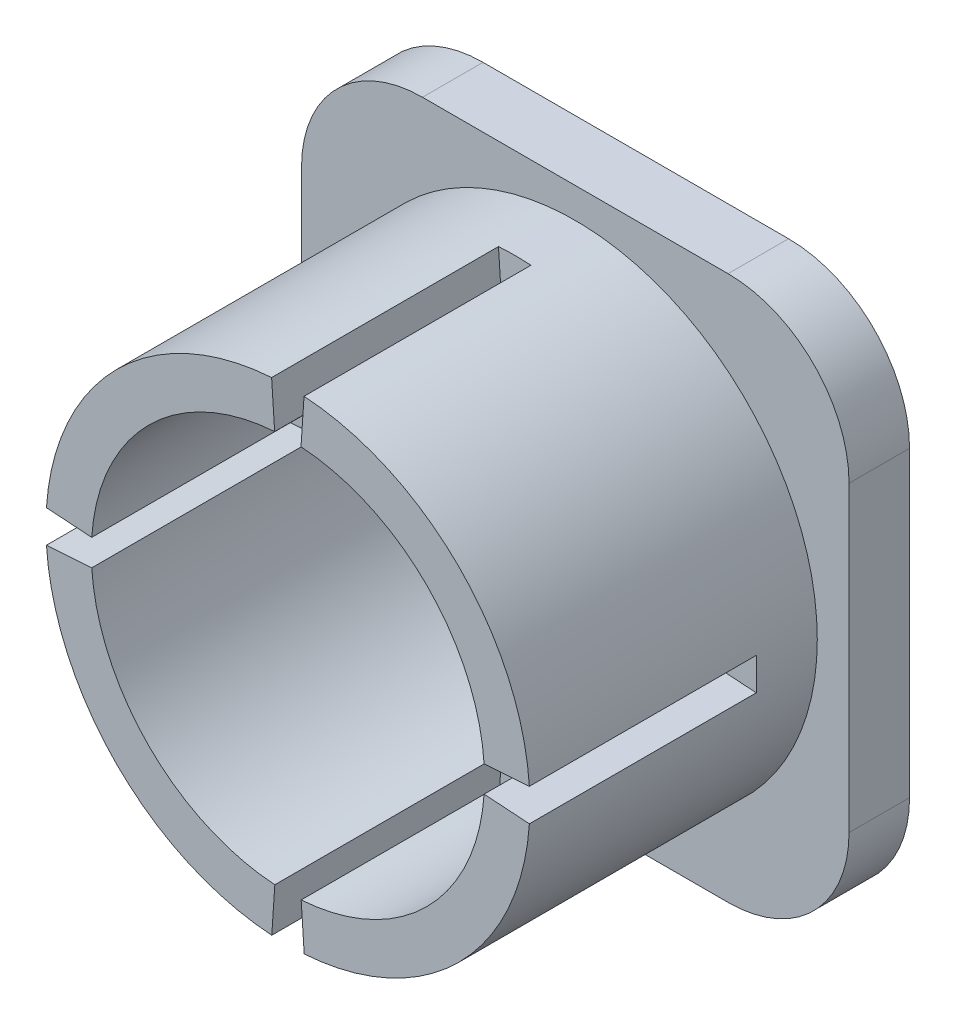
ISO-10303-21;
HEADER;
FILE_DESCRIPTION(('STEP AP214'),'2;1');
FILE_NAME('part.step','',(''),(''),'','','');
FILE_SCHEMA(('AUTOMOTIVE_DESIGN { 1 0 10303 214 1 1 1 1 }'));
ENDSEC;
DATA;
#1=APPLICATION_CONTEXT('core data for automotive mechanical design processes');
#2=APPLICATION_PROTOCOL_DEFINITION('international standard','automotive_design',2000,#1);
#3=PRODUCT_CONTEXT('',#1,'mechanical');
#4=PRODUCT('Part','Part','',(#3));
#5=PRODUCT_RELATED_PRODUCT_CATEGORY('part','',(#4));
#6=PRODUCT_DEFINITION_FORMATION('','',#4);
#7=PRODUCT_DEFINITION_CONTEXT('part definition',#1,'design');
#8=PRODUCT_DEFINITION('design','',#6,#7);
#9=PRODUCT_DEFINITION_SHAPE('','',#8);
#10=(LENGTH_UNIT() NAMED_UNIT(*) SI_UNIT(.MILLI.,.METRE.));
#11=(NAMED_UNIT(*) PLANE_ANGLE_UNIT() SI_UNIT($,.RADIAN.));
#12=(NAMED_UNIT(*) SI_UNIT($,.STERADIAN.) SOLID_ANGLE_UNIT());
#13=UNCERTAINTY_MEASURE_WITH_UNIT(LENGTH_MEASURE(1.E-05),#10,'distance_accuracy_value','');
#14=(GEOMETRIC_REPRESENTATION_CONTEXT(3) GLOBAL_UNCERTAINTY_ASSIGNED_CONTEXT((#13)) GLOBAL_UNIT_ASSIGNED_CONTEXT((#10,
#11,#12)) REPRESENTATION_CONTEXT('',''));
#15=CARTESIAN_POINT('',(0.,0.,0.));
#16=DIRECTION('',(0.,0.,1.));
#17=DIRECTION('',(1.,0.,0.));
#18=AXIS2_PLACEMENT_3D('',#15,#16,#17);
#19=CARTESIAN_POINT('',(0.,0.,11.5001));
#20=DIRECTION('',(0.,0.,-1.));
#21=DIRECTION('',(-1.,0.,0.));
#22=AXIS2_PLACEMENT_3D('',#19,#20,#21);
#23=CYLINDRICAL_SURFACE('',#22,8.);
#24=CARTESIAN_POINT('',(0.,0.,2.0001));
#25=DIRECTION('',(0.,0.,1.));
#26=DIRECTION('',(1.,0.,0.));
#27=AXIS2_PLACEMENT_3D('',#24,#25,#26);
#28=CIRCLE('',#27,8.);
#29=CARTESIAN_POINT('',(8.,0.,2.0001));
#30=VERTEX_POINT('',#29);
#31=EDGE_CURVE('E478',#30,#30,#28,.T.);
#32=ORIENTED_EDGE('',*,*,#31,.T.);
#33=EDGE_LOOP('',(#32));
#34=FACE_BOUND('',#33,.T.);
#35=DIRECTION('',(0.,0.,-1.));
#36=VECTOR('',#35,1.);
#37=CARTESIAN_POINT('',(-0.533399136129928,-7.98219802821101,11.5001));
#38=LINE('',#37,#36);
#39=CARTESIAN_POINT('',(-0.533399136129928,-7.98219802821102,11.5001));
#40=VERTEX_POINT('',#39);
#41=CARTESIAN_POINT('',(-0.533399136129928,-7.98219802821101,4.0001));
#42=VERTEX_POINT('',#41);
#43=EDGE_CURVE('E258',#40,#42,#38,.T.);
#44=ORIENTED_EDGE('',*,*,#43,.F.);
#45=CARTESIAN_POINT('',(0.,0.,11.5001));
#46=DIRECTION('',(0.,0.,1.));
#47=DIRECTION('',(1.,0.,0.));
#48=AXIS2_PLACEMENT_3D('',#45,#46,#47);
#49=CIRCLE('',#48,8.);
#50=CARTESIAN_POINT('',(-7.98181940167581,-0.539035285516247,11.5001));
#51=VERTEX_POINT('',#50);
#52=EDGE_CURVE('E230',#51,#40,#49,.T.);
#53=ORIENTED_EDGE('',*,*,#52,.F.);
#54=DIRECTION('',(0.,0.,-1.));
#55=VECTOR('',#54,1.);
#56=CARTESIAN_POINT('',(-7.98181940167581,-0.539035285516247,11.5001));
#57=LINE('',#56,#55);
#58=CARTESIAN_POINT('',(-7.98181940167581,-0.539035285516247,4.0001));
#59=VERTEX_POINT('',#58);
#60=EDGE_CURVE('E256',#51,#59,#57,.T.);
#61=ORIENTED_EDGE('',*,*,#60,.T.);
#62=CARTESIAN_POINT('',(0.,0.,4.0001));
#63=DIRECTION('',(0.,0.,-1.));
#64=DIRECTION('',(-1.,0.,0.));
#65=AXIS2_PLACEMENT_3D('',#62,#63,#64);
#66=CIRCLE('',#65,8.);
#67=CARTESIAN_POINT('',(-7.98219802821101,0.533399136130011,4.0001));
#68=VERTEX_POINT('',#67);
#69=EDGE_CURVE('E334',#59,#68,#66,.T.);
#70=ORIENTED_EDGE('',*,*,#69,.T.);
#71=DIRECTION('',(0.,0.,-1.));
#72=VECTOR('',#71,1.);
#73=CARTESIAN_POINT('',(-7.98219802821101,0.533399136130011,11.5001));
#74=LINE('',#73,#72);
#75=CARTESIAN_POINT('',(-7.98219802821101,0.533399136130012,11.5001));
#76=VERTEX_POINT('',#75);
#77=EDGE_CURVE('E337',#76,#68,#74,.T.);
#78=ORIENTED_EDGE('',*,*,#77,.F.);
#79=CARTESIAN_POINT('',(-0.539035285516331,7.98181940167581,11.5001));
#80=VERTEX_POINT('',#79);
#81=EDGE_CURVE('E228',#80,#76,#49,.T.);
#82=ORIENTED_EDGE('',*,*,#81,.F.);
#83=DIRECTION('',(0.,0.,-1.));
#84=VECTOR('',#83,1.);
#85=CARTESIAN_POINT('',(-0.539035285516331,7.98181940167581,11.5001));
#86=LINE('',#85,#84);
#87=CARTESIAN_POINT('',(-0.539035285516331,7.98181940167581,4.0001));
#88=VERTEX_POINT('',#87);
#89=EDGE_CURVE('E280',#80,#88,#86,.T.);
#90=ORIENTED_EDGE('',*,*,#89,.T.);
#91=CARTESIAN_POINT('',(0.,0.,4.0001));
#92=DIRECTION('',(0.,0.,-1.));
#93=DIRECTION('',(-1.,0.,0.));
#94=AXIS2_PLACEMENT_3D('',#91,#92,#93);
#95=CIRCLE('',#94,8.);
#96=CARTESIAN_POINT('',(0.533399136129928,7.98219802821101,4.0001));
#97=VERTEX_POINT('',#96);
#98=EDGE_CURVE('E276',#88,#97,#95,.T.);
#99=ORIENTED_EDGE('',*,*,#98,.T.);
#100=DIRECTION('',(0.,0.,-1.));
#101=VECTOR('',#100,1.);
#102=CARTESIAN_POINT('',(0.533399136129928,7.98219802821101,11.5001));
#103=LINE('',#102,#101);
#104=CARTESIAN_POINT('',(0.533399136129928,7.98219802821102,11.5001));
#105=VERTEX_POINT('',#104);
#106=EDGE_CURVE('E224',#105,#97,#103,.T.);
#107=ORIENTED_EDGE('',*,*,#106,.F.);
#108=CARTESIAN_POINT('',(7.98181940167581,0.539035285516303,11.5001));
#109=VERTEX_POINT('',#108);
#110=EDGE_CURVE('E215',#109,#105,#49,.T.);
#111=ORIENTED_EDGE('',*,*,#110,.F.);
#112=DIRECTION('',(0.,0.,-1.));
#113=VECTOR('',#112,1.);
#114=CARTESIAN_POINT('',(7.98181940167581,0.539035285516303,11.5001));
#115=LINE('',#114,#113);
#116=CARTESIAN_POINT('',(7.98181940167581,0.539035285516303,4.0001));
#117=VERTEX_POINT('',#116);
#118=EDGE_CURVE('E198',#109,#117,#115,.T.);
#119=ORIENTED_EDGE('',*,*,#118,.T.);
#120=CARTESIAN_POINT('',(0.,0.,4.0001));
#121=DIRECTION('',(0.,0.,-1.));
#122=DIRECTION('',(-1.,0.,0.));
#123=AXIS2_PLACEMENT_3D('',#120,#121,#122);
#124=CIRCLE('',#123,8.);
#125=CARTESIAN_POINT('',(7.98219802821101,-0.533399136129956,4.0001));
#126=VERTEX_POINT('',#125);
#127=EDGE_CURVE('E209',#117,#126,#124,.T.);
#128=ORIENTED_EDGE('',*,*,#127,.T.);
#129=DIRECTION('',(0.,0.,-1.));
#130=VECTOR('',#129,1.);
#131=CARTESIAN_POINT('',(7.98219802821101,-0.533399136129956,11.5001));
#132=LINE('',#131,#130);
#133=CARTESIAN_POINT('',(7.98219802821101,-0.533399136129956,11.5001));
#134=VERTEX_POINT('',#133);
#135=EDGE_CURVE('E208',#134,#126,#132,.T.);
#136=ORIENTED_EDGE('',*,*,#135,.F.);
#137=CARTESIAN_POINT('',(0.539035285516331,-7.98181940167581,11.5001));
#138=VERTEX_POINT('',#137);
#139=EDGE_CURVE('E225',#138,#134,#49,.T.);
#140=ORIENTED_EDGE('',*,*,#139,.F.);
#141=DIRECTION('',(0.,0.,-1.));
#142=VECTOR('',#141,1.);
#143=CARTESIAN_POINT('',(0.539035285516331,-7.98181940167581,11.5001));
#144=LINE('',#143,#142);
#145=CARTESIAN_POINT('',(0.539035285516331,-7.98181940167581,4.0001));
#146=VERTEX_POINT('',#145);
#147=EDGE_CURVE('E265',#138,#146,#144,.T.);
#148=ORIENTED_EDGE('',*,*,#147,.T.);
#149=CARTESIAN_POINT('',(0.,0.,4.0001));
#150=DIRECTION('',(0.,0.,-1.));
#151=DIRECTION('',(-1.,0.,0.));
#152=AXIS2_PLACEMENT_3D('',#149,#150,#151);
#153=CIRCLE('',#152,8.);
#154=EDGE_CURVE('E260',#146,#42,#153,.T.);
#155=ORIENTED_EDGE('',*,*,#154,.T.);
#156=EDGE_LOOP('',(#44,#53,#61,#70,#78,#82,#90,#99,#107,#111,#119,#128,#136,#140,#148,#155));
#157=FACE_BOUND('',#156,.T.);
#158=ADVANCED_FACE('F38',(#34,#157),#23,.T.);
#159=CARTESIAN_POINT('',(0.,0.,11.5001));
#160=DIRECTION('',(0.,0.,1.));
#161=DIRECTION('',(1.,0.,0.));
#162=AXIS2_PLACEMENT_3D('',#159,#160,#161);
#163=PLANE('',#162);
#164=ORIENTED_EDGE('',*,*,#52,.T.);
#165=DIRECTION('',(0.0670548759780809,0.997749288953675,0.));
#166=VECTOR('',#165,1.);
#167=CARTESIAN_POINT('',(-0.547169202293291,-8.18709101358962,11.5001));
#168=LINE('',#167,#166);
#169=CARTESIAN_POINT('',(-0.432816813185524,-6.4855739612022,11.5001));
#170=VERTEX_POINT('',#169);
#171=EDGE_CURVE('E251',#40,#170,#168,.T.);
#172=ORIENTED_EDGE('',*,*,#171,.T.);
#173=CARTESIAN_POINT('',(0.,0.,11.5001));
#174=DIRECTION('',(0.,0.,1.));
#175=DIRECTION('',(1.,0.,0.));
#176=AXIS2_PLACEMENT_3D('',#173,#174,#175);
#177=CIRCLE('',#176,6.5);
#178=CARTESIAN_POINT('',(-6.48519537080282,-0.438452965000409,11.5001));
#179=VERTEX_POINT('',#178);
#180=EDGE_CURVE('E291',#179,#170,#177,.T.);
#181=ORIENTED_EDGE('',*,*,#180,.F.);
#182=DIRECTION('',(0.997749288953676,0.0670548759780706,0.));
#183=VECTOR('',#182,1.);
#184=CARTESIAN_POINT('',(-8.18709101358962,-0.552830797706623,11.5001));
#185=LINE('',#184,#183);
#186=EDGE_CURVE('E253',#51,#179,#185,.T.);
#187=ORIENTED_EDGE('',*,*,#186,.F.);
#188=EDGE_LOOP('',(#164,#172,#181,#187));
#189=FACE_BOUND('',#188,.T.);
#190=ADVANCED_FACE('F249',(#189),#163,.T.);
#191=ORIENTED_EDGE('',*,*,#81,.T.);
#192=DIRECTION('',(0.997749288953674,-0.0670548759780914,0.));
#193=VECTOR('',#192,1.);
#194=CARTESIAN_POINT('',(-8.18709101358961,0.547169202293377,11.5001));
#195=LINE('',#194,#193);
#196=CARTESIAN_POINT('',(-6.48557396120219,0.432816813185592,11.5001));
#197=VERTEX_POINT('',#196);
#198=EDGE_CURVE('E344',#76,#197,#195,.T.);
#199=ORIENTED_EDGE('',*,*,#198,.T.);
#200=CARTESIAN_POINT('',(-0.438452965000477,6.48519537080282,11.5001));
#201=VERTEX_POINT('',#200);
#202=EDGE_CURVE('E232',#201,#197,#177,.T.);
#203=ORIENTED_EDGE('',*,*,#202,.F.);
#204=DIRECTION('',(0.067054875978081,-0.997749288953675,0.));
#205=VECTOR('',#204,1.);
#206=CARTESIAN_POINT('',(-0.552830797706709,8.18709101358962,11.5001));
#207=LINE('',#206,#205);
#208=EDGE_CURVE('E267',#80,#201,#207,.T.);
#209=ORIENTED_EDGE('',*,*,#208,.F.);
#210=EDGE_LOOP('',(#191,#199,#203,#209));
#211=FACE_BOUND('',#210,.T.);
#212=ADVANCED_FACE('F384',(#211),#163,.T.);
#213=DIRECTION('',(-0.067054875978081,0.997749288953675,0.));
#214=VECTOR('',#213,1.);
#215=CARTESIAN_POINT('',(0.552830797706709,-8.18709101358962,11.5001));
#216=LINE('',#215,#214);
#217=CARTESIAN_POINT('',(0.438452965000477,-6.48519537080282,11.5001));
#218=VERTEX_POINT('',#217);
#219=EDGE_CURVE('E322',#138,#218,#216,.T.);
#220=ORIENTED_EDGE('',*,*,#219,.F.);
#221=ORIENTED_EDGE('',*,*,#139,.T.);
#222=DIRECTION('',(-0.997749288953675,0.0670548759780844,0.));
#223=VECTOR('',#222,1.);
#224=CARTESIAN_POINT('',(8.18709101358961,-0.54716920229332,11.5001));
#225=LINE('',#224,#223);
#226=CARTESIAN_POINT('',(6.48557396120219,-0.432816813185547,11.5001));
#227=VERTEX_POINT('',#226);
#228=EDGE_CURVE('E219',#134,#227,#225,.T.);
#229=ORIENTED_EDGE('',*,*,#228,.T.);
#230=EDGE_CURVE('E285',#218,#227,#177,.T.);
#231=ORIENTED_EDGE('',*,*,#230,.F.);
#232=EDGE_LOOP('',(#220,#221,#229,#231));
#233=FACE_BOUND('',#232,.T.);
#234=ADVANCED_FACE('F321',(#233),#163,.T.);
#235=CARTESIAN_POINT('',(0.,0.,-22.9999));
#236=DIRECTION('',(0.,0.,1.));
#237=DIRECTION('',(1.,0.,0.));
#238=AXIS2_PLACEMENT_3D('',#235,#236,#237);
#239=CYLINDRICAL_SURFACE('',#238,6.5);
#240=CARTESIAN_POINT('',(0.,0.,0.));
#241=DIRECTION('',(0.,0.,1.));
#242=DIRECTION('',(1.,0.,0.));
#243=AXIS2_PLACEMENT_3D('',#240,#241,#242);
#244=CIRCLE('',#243,6.5);
#245=CARTESIAN_POINT('',(6.5,0.,0.));
#246=VERTEX_POINT('',#245);
#247=EDGE_CURVE('E226',#246,#246,#244,.T.);
#248=ORIENTED_EDGE('',*,*,#247,.F.);
#249=EDGE_LOOP('',(#248));
#250=FACE_BOUND('',#249,.T.);
#251=DIRECTION('',(0.,0.,1.));
#252=VECTOR('',#251,1.);
#253=CARTESIAN_POINT('',(-0.432816813185524,-6.4855739612022,-22.9999));
#254=LINE('',#253,#252);
#255=CARTESIAN_POINT('',(-0.432816813185524,-6.4855739612022,4.0001));
#256=VERTEX_POINT('',#255);
#257=EDGE_CURVE('E11',#256,#170,#254,.T.);
#258=ORIENTED_EDGE('',*,*,#257,.F.);
#259=CARTESIAN_POINT('',(0.,0.,4.0001));
#260=DIRECTION('',(0.,0.,-1.));
#261=DIRECTION('',(-1.,0.,0.));
#262=AXIS2_PLACEMENT_3D('',#259,#260,#261);
#263=CIRCLE('',#262,6.5);
#264=CARTESIAN_POINT('',(0.438452965000477,-6.48519537080282,4.0001));
#265=VERTEX_POINT('',#264);
#266=EDGE_CURVE('E308',#256,#265,#263,.F.);
#267=ORIENTED_EDGE('',*,*,#266,.T.);
#268=DIRECTION('',(0.,0.,1.));
#269=VECTOR('',#268,1.);
#270=CARTESIAN_POINT('',(0.438452965000477,-6.48519537080282,-22.9999));
#271=LINE('',#270,#269);
#272=EDGE_CURVE('E46',#265,#218,#271,.T.);
#273=ORIENTED_EDGE('',*,*,#272,.T.);
#274=ORIENTED_EDGE('',*,*,#230,.T.);
#275=DIRECTION('',(0.,0.,1.));
#276=VECTOR('',#275,1.);
#277=CARTESIAN_POINT('',(6.48557396120219,-0.432816813185547,-22.9999));
#278=LINE('',#277,#276);
#279=CARTESIAN_POINT('',(6.48557396120219,-0.432816813185547,4.0001));
#280=VERTEX_POINT('',#279);
#281=EDGE_CURVE('E310',#280,#227,#278,.T.);
#282=ORIENTED_EDGE('',*,*,#281,.F.);
#283=CARTESIAN_POINT('',(0.,0.,4.0001));
#284=DIRECTION('',(0.,0.,-1.));
#285=DIRECTION('',(-1.,0.,0.));
#286=AXIS2_PLACEMENT_3D('',#283,#284,#285);
#287=CIRCLE('',#286,6.5);
#288=CARTESIAN_POINT('',(6.48519537080282,0.438452965000454,4.0001));
#289=VERTEX_POINT('',#288);
#290=EDGE_CURVE('E358',#280,#289,#287,.F.);
#291=ORIENTED_EDGE('',*,*,#290,.T.);
#292=DIRECTION('',(0.,0.,1.));
#293=VECTOR('',#292,1.);
#294=CARTESIAN_POINT('',(6.48519537080282,0.438452965000454,-22.9999));
#295=LINE('',#294,#293);
#296=CARTESIAN_POINT('',(6.48519537080282,0.438452965000454,11.5001));
#297=VERTEX_POINT('',#296);
#298=EDGE_CURVE('E359',#289,#297,#295,.T.);
#299=ORIENTED_EDGE('',*,*,#298,.T.);
#300=CARTESIAN_POINT('',(0.432816813185524,6.4855739612022,11.5001));
#301=VERTEX_POINT('',#300);
#302=EDGE_CURVE('E217',#297,#301,#177,.T.);
#303=ORIENTED_EDGE('',*,*,#302,.T.);
#304=DIRECTION('',(0.,0.,1.));
#305=VECTOR('',#304,1.);
#306=CARTESIAN_POINT('',(0.432816813185524,6.4855739612022,-22.9999));
#307=LINE('',#306,#305);
#308=CARTESIAN_POINT('',(0.432816813185524,6.4855739612022,4.0001));
#309=VERTEX_POINT('',#308);
#310=EDGE_CURVE('E361',#309,#301,#307,.T.);
#311=ORIENTED_EDGE('',*,*,#310,.F.);
#312=CARTESIAN_POINT('',(0.,0.,4.0001));
#313=DIRECTION('',(0.,0.,-1.));
#314=DIRECTION('',(-1.,0.,0.));
#315=AXIS2_PLACEMENT_3D('',#312,#313,#314);
#316=CIRCLE('',#315,6.5);
#317=CARTESIAN_POINT('',(-0.438452965000477,6.48519537080282,4.0001));
#318=VERTEX_POINT('',#317);
#319=EDGE_CURVE('E479',#309,#318,#316,.F.);
#320=ORIENTED_EDGE('',*,*,#319,.T.);
#321=DIRECTION('',(0.,0.,1.));
#322=VECTOR('',#321,1.);
#323=CARTESIAN_POINT('',(-0.438452965000477,6.48519537080282,-22.9999));
#324=LINE('',#323,#322);
#325=EDGE_CURVE('E363',#318,#201,#324,.T.);
#326=ORIENTED_EDGE('',*,*,#325,.T.);
#327=ORIENTED_EDGE('',*,*,#202,.T.);
#328=DIRECTION('',(0.,0.,1.));
#329=VECTOR('',#328,1.);
#330=CARTESIAN_POINT('',(-6.48557396120219,0.432816813185592,-22.9999));
#331=LINE('',#330,#329);
#332=CARTESIAN_POINT('',(-6.48557396120219,0.432816813185592,4.0001));
#333=VERTEX_POINT('',#332);
#334=EDGE_CURVE('E306',#333,#197,#331,.T.);
#335=ORIENTED_EDGE('',*,*,#334,.F.);
#336=CARTESIAN_POINT('',(0.,0.,4.0001));
#337=DIRECTION('',(0.,0.,-1.));
#338=DIRECTION('',(-1.,0.,0.));
#339=AXIS2_PLACEMENT_3D('',#336,#337,#338);
#340=CIRCLE('',#339,6.5);
#341=CARTESIAN_POINT('',(-6.48519537080282,-0.438452965000409,4.0001));
#342=VERTEX_POINT('',#341);
#343=EDGE_CURVE('E304',#333,#342,#340,.F.);
#344=ORIENTED_EDGE('',*,*,#343,.T.);
#345=DIRECTION('',(0.,0.,1.));
#346=VECTOR('',#345,1.);
#347=CARTESIAN_POINT('',(-6.48519537080282,-0.438452965000409,-22.9999));
#348=LINE('',#347,#346);
#349=EDGE_CURVE('E303',#342,#179,#348,.T.);
#350=ORIENTED_EDGE('',*,*,#349,.T.);
#351=ORIENTED_EDGE('',*,*,#180,.T.);
#352=EDGE_LOOP('',(#258,#267,#273,#274,#282,#291,#299,#303,#311,#320,#326,#327,#335,#344,#350,#351));
#353=FACE_BOUND('',#352,.T.);
#354=ADVANCED_FACE('F300',(#250,#353),#239,.F.);
#355=DIRECTION('',(-0.997749288953675,-0.0670548759780775,0.));
#356=VECTOR('',#355,1.);
#357=CARTESIAN_POINT('',(8.18709101358962,0.55283079770668,11.5001));
#358=LINE('',#357,#356);
#359=EDGE_CURVE('E202',#109,#297,#358,.T.);
#360=ORIENTED_EDGE('',*,*,#359,.F.);
#361=ORIENTED_EDGE('',*,*,#110,.T.);
#362=DIRECTION('',(-0.0670548759780809,-0.997749288953675,0.));
#363=VECTOR('',#362,1.);
#364=CARTESIAN_POINT('',(0.547169202293291,8.18709101358962,11.5001));
#365=LINE('',#364,#363);
#366=EDGE_CURVE('E264',#105,#301,#365,.T.);
#367=ORIENTED_EDGE('',*,*,#366,.T.);
#368=ORIENTED_EDGE('',*,*,#302,.F.);
#369=EDGE_LOOP('',(#360,#361,#367,#368));
#370=FACE_BOUND('',#369,.T.);
#371=ADVANCED_FACE('F213',(#370),#163,.T.);
#372=CARTESIAN_POINT('',(-5.05,-5.00010840081194,0.0001));
#373=DIRECTION('',(0.,0.,-1.));
#374=DIRECTION('',(-1.,0.,0.));
#375=AXIS2_PLACEMENT_3D('',#372,#373,#374);
#376=CYLINDRICAL_SURFACE('',#375,4.);
#377=CARTESIAN_POINT('',(-5.05,-5.00010840081194,0.));
#378=DIRECTION('',(0.,0.,1.));
#379=DIRECTION('',(1.,0.,0.));
#380=AXIS2_PLACEMENT_3D('',#377,#378,#379);
#381=CIRCLE('',#380,4.);
#382=CARTESIAN_POINT('',(-9.05,-5.00010840081191,0.));
#383=VERTEX_POINT('',#382);
#384=CARTESIAN_POINT('',(-5.04999999999997,-9.00010840081194,0.));
#385=VERTEX_POINT('',#384);
#386=EDGE_CURVE('E440',#383,#385,#381,.T.);
#387=ORIENTED_EDGE('',*,*,#386,.T.);
#388=DIRECTION('',(0.,0.,-1.));
#389=VECTOR('',#388,1.);
#390=CARTESIAN_POINT('',(-5.04999999999997,-9.00010840081194,0.0001));
#391=LINE('',#390,#389);
#392=CARTESIAN_POINT('',(-5.04999999999997,-9.00010840081194,2.0001));
#393=VERTEX_POINT('',#392);
#394=EDGE_CURVE('E434',#393,#385,#391,.T.);
#395=ORIENTED_EDGE('',*,*,#394,.F.);
#396=CARTESIAN_POINT('',(-5.05,-5.00010840081194,2.0001));
#397=DIRECTION('',(0.,0.,1.));
#398=DIRECTION('',(1.,0.,0.));
#399=AXIS2_PLACEMENT_3D('',#396,#397,#398);
#400=CIRCLE('',#399,4.);
#401=CARTESIAN_POINT('',(-9.05,-5.00010840081191,2.0001));
#402=VERTEX_POINT('',#401);
#403=EDGE_CURVE('E236',#402,#393,#400,.T.);
#404=ORIENTED_EDGE('',*,*,#403,.F.);
#405=DIRECTION('',(0.,0.,-1.));
#406=VECTOR('',#405,1.);
#407=CARTESIAN_POINT('',(-9.05,-5.00010840081191,0.0001));
#408=LINE('',#407,#406);
#409=EDGE_CURVE('E463',#402,#383,#408,.T.);
#410=ORIENTED_EDGE('',*,*,#409,.T.);
#411=EDGE_LOOP('',(#387,#395,#404,#410));
#412=FACE_BOUND('',#411,.T.);
#413=ADVANCED_FACE('F40',(#412),#376,.T.);
#414=CARTESIAN_POINT('',(-5.04999999999997,-9.00010840081194,0.0001));
#415=DIRECTION('',(0.,1.,0.));
#416=DIRECTION('',(0.,0.,1.));
#417=AXIS2_PLACEMENT_3D('',#414,#415,#416);
#418=PLANE('',#417);
#419=DIRECTION('',(1.,0.,0.));
#420=VECTOR('',#419,1.);
#421=CARTESIAN_POINT('',(-5.04999999999997,-9.00010840081194,0.));
#422=LINE('',#421,#420);
#423=CARTESIAN_POINT('',(5.04999999999997,-9.00010840081194,0.));
#424=VERTEX_POINT('',#423);
#425=EDGE_CURVE('E429',#385,#424,#422,.T.);
#426=ORIENTED_EDGE('',*,*,#425,.T.);
#427=DIRECTION('',(0.,0.,-1.));
#428=VECTOR('',#427,1.);
#429=CARTESIAN_POINT('',(5.04999999999997,-9.00010840081194,0.0001));
#430=LINE('',#429,#428);
#431=CARTESIAN_POINT('',(5.04999999999997,-9.00010840081194,2.0001));
#432=VERTEX_POINT('',#431);
#433=EDGE_CURVE('E432',#432,#424,#430,.T.);
#434=ORIENTED_EDGE('',*,*,#433,.F.);
#435=DIRECTION('',(1.,0.,0.));
#436=VECTOR('',#435,1.);
#437=CARTESIAN_POINT('',(-5.04999999999997,-9.00010840081194,2.0001));
#438=LINE('',#437,#436);
#439=EDGE_CURVE('E242',#393,#432,#438,.T.);
#440=ORIENTED_EDGE('',*,*,#439,.F.);
#441=ORIENTED_EDGE('',*,*,#394,.T.);
#442=EDGE_LOOP('',(#426,#434,#440,#441));
#443=FACE_BOUND('',#442,.T.);
#444=ADVANCED_FACE('F420',(#443),#418,.F.);
#445=CARTESIAN_POINT('',(5.05,-5.00010840081194,0.0001));
#446=DIRECTION('',(0.,0.,-1.));
#447=DIRECTION('',(-1.,0.,0.));
#448=AXIS2_PLACEMENT_3D('',#445,#446,#447);
#449=CYLINDRICAL_SURFACE('',#448,4.);
#450=CARTESIAN_POINT('',(5.05,-5.00010840081194,0.));
#451=DIRECTION('',(0.,0.,1.));
#452=DIRECTION('',(1.,0.,0.));
#453=AXIS2_PLACEMENT_3D('',#450,#451,#452);
#454=CIRCLE('',#453,4.);
#455=CARTESIAN_POINT('',(9.05,-5.00010840081191,0.));
#456=VERTEX_POINT('',#455);
#457=EDGE_CURVE('E439',#424,#456,#454,.T.);
#458=ORIENTED_EDGE('',*,*,#457,.T.);
#459=DIRECTION('',(0.,0.,-1.));
#460=VECTOR('',#459,1.);
#461=CARTESIAN_POINT('',(9.05,-5.00010840081191,0.0001));
#462=LINE('',#461,#460);
#463=CARTESIAN_POINT('',(9.05,-5.00010840081191,2.0001));
#464=VERTEX_POINT('',#463);
#465=EDGE_CURVE('E446',#464,#456,#462,.T.);
#466=ORIENTED_EDGE('',*,*,#465,.F.);
#467=CARTESIAN_POINT('',(5.05,-5.00010840081194,2.0001));
#468=DIRECTION('',(0.,0.,1.));
#469=DIRECTION('',(1.,0.,0.));
#470=AXIS2_PLACEMENT_3D('',#467,#468,#469);
#471=CIRCLE('',#470,4.);
#472=EDGE_CURVE('E445',#432,#464,#471,.T.);
#473=ORIENTED_EDGE('',*,*,#472,.F.);
#474=ORIENTED_EDGE('',*,*,#433,.T.);
#475=EDGE_LOOP('',(#458,#466,#473,#474));
#476=FACE_BOUND('',#475,.T.);
#477=ADVANCED_FACE('F417',(#476),#449,.T.);
#478=CARTESIAN_POINT('',(9.05,5.00010840081191,0.0001));
#479=DIRECTION('',(-1.,0.,0.));
#480=DIRECTION('',(0.,-1.,0.));
#481=AXIS2_PLACEMENT_3D('',#478,#479,#480);
#482=PLANE('',#481);
#483=DIRECTION('',(0.,1.,0.));
#484=VECTOR('',#483,1.);
#485=CARTESIAN_POINT('',(9.05,5.00010840081191,0.));
#486=LINE('',#485,#484);
#487=CARTESIAN_POINT('',(9.05,5.00010840081191,0.));
#488=VERTEX_POINT('',#487);
#489=EDGE_CURVE('E450',#456,#488,#486,.T.);
#490=ORIENTED_EDGE('',*,*,#489,.T.);
#491=DIRECTION('',(0.,0.,-1.));
#492=VECTOR('',#491,1.);
#493=CARTESIAN_POINT('',(9.05,5.00010840081191,0.0001));
#494=LINE('',#493,#492);
#495=CARTESIAN_POINT('',(9.05,5.00010840081191,2.0001));
#496=VERTEX_POINT('',#495);
#497=EDGE_CURVE('E475',#496,#488,#494,.T.);
#498=ORIENTED_EDGE('',*,*,#497,.F.);
#499=DIRECTION('',(0.,1.,0.));
#500=VECTOR('',#499,1.);
#501=CARTESIAN_POINT('',(9.05,5.00010840081191,2.0001));
#502=LINE('',#501,#500);
#503=EDGE_CURVE('E485',#464,#496,#502,.T.);
#504=ORIENTED_EDGE('',*,*,#503,.F.);
#505=ORIENTED_EDGE('',*,*,#465,.T.);
#506=EDGE_LOOP('',(#490,#498,#504,#505));
#507=FACE_BOUND('',#506,.T.);
#508=ADVANCED_FACE('F413',(#507),#482,.F.);
#509=CARTESIAN_POINT('',(5.05,5.00010840081194,0.0001));
#510=DIRECTION('',(0.,0.,-1.));
#511=DIRECTION('',(-1.,0.,0.));
#512=AXIS2_PLACEMENT_3D('',#509,#510,#511);
#513=CYLINDRICAL_SURFACE('',#512,4.);
#514=CARTESIAN_POINT('',(5.05,5.00010840081194,0.));
#515=DIRECTION('',(0.,0.,1.));
#516=DIRECTION('',(-1.,0.,0.));
#517=AXIS2_PLACEMENT_3D('',#514,#515,#516);
#518=CIRCLE('',#517,4.);
#519=CARTESIAN_POINT('',(5.04999999999997,9.00010840081194,0.));
#520=VERTEX_POINT('',#519);
#521=EDGE_CURVE('E452',#488,#520,#518,.T.);
#522=ORIENTED_EDGE('',*,*,#521,.T.);
#523=DIRECTION('',(0.,0.,-1.));
#524=VECTOR('',#523,1.);
#525=CARTESIAN_POINT('',(5.04999999999997,9.00010840081194,0.0001));
#526=LINE('',#525,#524);
#527=CARTESIAN_POINT('',(5.04999999999997,9.00010840081194,2.0001));
#528=VERTEX_POINT('',#527);
#529=EDGE_CURVE('E472',#528,#520,#526,.T.);
#530=ORIENTED_EDGE('',*,*,#529,.F.);
#531=CARTESIAN_POINT('',(5.05,5.00010840081194,2.0001));
#532=DIRECTION('',(0.,0.,1.));
#533=DIRECTION('',(-1.,0.,0.));
#534=AXIS2_PLACEMENT_3D('',#531,#532,#533);
#535=CIRCLE('',#534,4.);
#536=EDGE_CURVE('E488',#496,#528,#535,.T.);
#537=ORIENTED_EDGE('',*,*,#536,.F.);
#538=ORIENTED_EDGE('',*,*,#497,.T.);
#539=EDGE_LOOP('',(#522,#530,#537,#538));
#540=FACE_BOUND('',#539,.T.);
#541=ADVANCED_FACE('F409',(#540),#513,.T.);
#542=CARTESIAN_POINT('',(-5.04999999999997,9.00010840081194,0.0001));
#543=DIRECTION('',(0.,-1.,0.));
#544=DIRECTION('',(0.,0.,-1.));
#545=AXIS2_PLACEMENT_3D('',#542,#543,#544);
#546=PLANE('',#545);
#547=DIRECTION('',(-1.,0.,0.));
#548=VECTOR('',#547,1.);
#549=CARTESIAN_POINT('',(-5.04999999999997,9.00010840081194,0.));
#550=LINE('',#549,#548);
#551=CARTESIAN_POINT('',(-5.04999999999997,9.00010840081194,0.));
#552=VERTEX_POINT('',#551);
#553=EDGE_CURVE('E457',#520,#552,#550,.T.);
#554=ORIENTED_EDGE('',*,*,#553,.T.);
#555=DIRECTION('',(0.,0.,-1.));
#556=VECTOR('',#555,1.);
#557=CARTESIAN_POINT('',(-5.04999999999997,9.00010840081194,0.0001));
#558=LINE('',#557,#556);
#559=CARTESIAN_POINT('',(-5.04999999999997,9.00010840081194,2.0001));
#560=VERTEX_POINT('',#559);
#561=EDGE_CURVE('E469',#560,#552,#558,.T.);
#562=ORIENTED_EDGE('',*,*,#561,.F.);
#563=DIRECTION('',(-1.,0.,0.));
#564=VECTOR('',#563,1.);
#565=CARTESIAN_POINT('',(-5.04999999999997,9.00010840081194,2.0001));
#566=LINE('',#565,#564);
#567=EDGE_CURVE('E491',#528,#560,#566,.T.);
#568=ORIENTED_EDGE('',*,*,#567,.F.);
#569=ORIENTED_EDGE('',*,*,#529,.T.);
#570=EDGE_LOOP('',(#554,#562,#568,#569));
#571=FACE_BOUND('',#570,.T.);
#572=ADVANCED_FACE('F405',(#571),#546,.F.);
#573=CARTESIAN_POINT('',(-5.05,5.00010840081194,0.0001));
#574=DIRECTION('',(0.,0.,-1.));
#575=DIRECTION('',(-1.,0.,0.));
#576=AXIS2_PLACEMENT_3D('',#573,#574,#575);
#577=CYLINDRICAL_SURFACE('',#576,4.);
#578=CARTESIAN_POINT('',(-5.05,5.00010840081194,0.));
#579=DIRECTION('',(0.,0.,1.));
#580=DIRECTION('',(1.,0.,0.));
#581=AXIS2_PLACEMENT_3D('',#578,#579,#580);
#582=CIRCLE('',#581,4.);
#583=CARTESIAN_POINT('',(-9.05,5.00010840081191,0.));
#584=VERTEX_POINT('',#583);
#585=EDGE_CURVE('E459',#552,#584,#582,.T.);
#586=ORIENTED_EDGE('',*,*,#585,.T.);
#587=DIRECTION('',(0.,0.,-1.));
#588=VECTOR('',#587,1.);
#589=CARTESIAN_POINT('',(-9.05,5.00010840081191,0.0001));
#590=LINE('',#589,#588);
#591=CARTESIAN_POINT('',(-9.05,5.00010840081191,2.0001));
#592=VERTEX_POINT('',#591);
#593=EDGE_CURVE('E466',#592,#584,#590,.T.);
#594=ORIENTED_EDGE('',*,*,#593,.F.);
#595=CARTESIAN_POINT('',(-5.05,5.00010840081194,2.0001));
#596=DIRECTION('',(0.,0.,1.));
#597=DIRECTION('',(1.,0.,0.));
#598=AXIS2_PLACEMENT_3D('',#595,#596,#597);
#599=CIRCLE('',#598,4.);
#600=EDGE_CURVE('E494',#560,#592,#599,.T.);
#601=ORIENTED_EDGE('',*,*,#600,.F.);
#602=ORIENTED_EDGE('',*,*,#561,.T.);
#603=EDGE_LOOP('',(#586,#594,#601,#602));
#604=FACE_BOUND('',#603,.T.);
#605=ADVANCED_FACE('F401',(#604),#577,.T.);
#606=CARTESIAN_POINT('',(-9.05,5.00010840081191,0.0001));
#607=DIRECTION('',(1.,0.,0.));
#608=DIRECTION('',(0.,1.,0.));
#609=AXIS2_PLACEMENT_3D('',#606,#607,#608);
#610=PLANE('',#609);
#611=DIRECTION('',(0.,-1.,0.));
#612=VECTOR('',#611,1.);
#613=CARTESIAN_POINT('',(-9.05,5.00010840081191,0.));
#614=LINE('',#613,#612);
#615=EDGE_CURVE('E461',#584,#383,#614,.T.);
#616=ORIENTED_EDGE('',*,*,#615,.T.);
#617=ORIENTED_EDGE('',*,*,#409,.F.);
#618=DIRECTION('',(0.,-1.,0.));
#619=VECTOR('',#618,1.);
#620=CARTESIAN_POINT('',(-9.05,5.00010840081191,2.0001));
#621=LINE('',#620,#619);
#622=EDGE_CURVE('E497',#592,#402,#621,.T.);
#623=ORIENTED_EDGE('',*,*,#622,.F.);
#624=ORIENTED_EDGE('',*,*,#593,.T.);
#625=EDGE_LOOP('',(#616,#617,#623,#624));
#626=FACE_BOUND('',#625,.T.);
#627=ADVANCED_FACE('F397',(#626),#610,.F.);
#628=CARTESIAN_POINT('',(-5.05,-5.00010840081194,0.));
#629=DIRECTION('',(0.,0.,1.));
#630=DIRECTION('',(1.,0.,0.));
#631=AXIS2_PLACEMENT_3D('',#628,#629,#630);
#632=PLANE('',#631);
#633=ORIENTED_EDGE('',*,*,#247,.T.);
#634=EDGE_LOOP('',(#633));
#635=FACE_BOUND('',#634,.T.);
#636=ORIENTED_EDGE('',*,*,#386,.F.);
#637=ORIENTED_EDGE('',*,*,#615,.F.);
#638=ORIENTED_EDGE('',*,*,#585,.F.);
#639=ORIENTED_EDGE('',*,*,#553,.F.);
#640=ORIENTED_EDGE('',*,*,#521,.F.);
#641=ORIENTED_EDGE('',*,*,#489,.F.);
#642=ORIENTED_EDGE('',*,*,#457,.F.);
#643=ORIENTED_EDGE('',*,*,#425,.F.);
#644=EDGE_LOOP('',(#636,#637,#638,#639,#640,#641,#642,#643));
#645=FACE_BOUND('',#644,.T.);
#646=ADVANCED_FACE('F393',(#635,#645),#632,.F.);
#647=CARTESIAN_POINT('',(-5.05,-5.00010840081194,2.0001));
#648=DIRECTION('',(0.,0.,1.));
#649=DIRECTION('',(1.,0.,0.));
#650=AXIS2_PLACEMENT_3D('',#647,#648,#649);
#651=PLANE('',#650);
#652=ORIENTED_EDGE('',*,*,#31,.F.);
#653=EDGE_LOOP('',(#652));
#654=FACE_BOUND('',#653,.T.);
#655=ORIENTED_EDGE('',*,*,#403,.T.);
#656=ORIENTED_EDGE('',*,*,#439,.T.);
#657=ORIENTED_EDGE('',*,*,#472,.T.);
#658=ORIENTED_EDGE('',*,*,#503,.T.);
#659=ORIENTED_EDGE('',*,*,#536,.T.);
#660=ORIENTED_EDGE('',*,*,#567,.T.);
#661=ORIENTED_EDGE('',*,*,#600,.T.);
#662=ORIENTED_EDGE('',*,*,#622,.T.);
#663=EDGE_LOOP('',(#655,#656,#657,#658,#659,#660,#661,#662));
#664=FACE_BOUND('',#663,.T.);
#665=ADVANCED_FACE('F389',(#654,#664),#651,.T.);
#666=CARTESIAN_POINT('',(0.547169202293291,8.18709101358962,4.0001));
#667=DIRECTION('',(-0.997749288953675,0.0670548759780809,0.));
#668=DIRECTION('',(-0.0670548759780809,-0.997749288953675,0.));
#669=AXIS2_PLACEMENT_3D('',#666,#667,#668);
#670=PLANE('',#669);
#671=ORIENTED_EDGE('',*,*,#106,.T.);
#672=DIRECTION('',(-0.0670548759780809,-0.997749288953675,0.));
#673=VECTOR('',#672,1.);
#674=CARTESIAN_POINT('',(0.547169202293291,8.18709101358962,4.0001));
#675=LINE('',#674,#673);
#676=EDGE_CURVE('E272',#97,#309,#675,.T.);
#677=ORIENTED_EDGE('',*,*,#676,.T.);
#678=ORIENTED_EDGE('',*,*,#310,.T.);
#679=ORIENTED_EDGE('',*,*,#366,.F.);
#680=EDGE_LOOP('',(#671,#677,#678,#679));
#681=FACE_BOUND('',#680,.T.);
#682=ADVANCED_FACE('F392',(#681),#670,.T.);
#683=CARTESIAN_POINT('',(-0.552830797706709,8.18709101358962,4.0001));
#684=DIRECTION('',(-0.997749288953675,-0.067054875978081,0.));
#685=DIRECTION('',(0.067054875978081,-0.997749288953675,0.));
#686=AXIS2_PLACEMENT_3D('',#683,#684,#685);
#687=PLANE('',#686);
#688=ORIENTED_EDGE('',*,*,#208,.T.);
#689=ORIENTED_EDGE('',*,*,#325,.F.);
#690=DIRECTION('',(0.067054875978081,-0.997749288953675,0.));
#691=VECTOR('',#690,1.);
#692=CARTESIAN_POINT('',(-0.552830797706709,8.18709101358962,4.0001));
#693=LINE('',#692,#691);
#694=EDGE_CURVE('E275',#88,#318,#693,.T.);
#695=ORIENTED_EDGE('',*,*,#694,.F.);
#696=ORIENTED_EDGE('',*,*,#89,.F.);
#697=EDGE_LOOP('',(#688,#689,#695,#696));
#698=FACE_BOUND('',#697,.T.);
#699=ADVANCED_FACE('F375',(#698),#687,.F.);
#700=CARTESIAN_POINT('',(0.,0.,4.0001));
#701=DIRECTION('',(0.,0.,-1.));
#702=DIRECTION('',(-1.,0.,0.));
#703=AXIS2_PLACEMENT_3D('',#700,#701,#702);
#704=PLANE('',#703);
#705=ORIENTED_EDGE('',*,*,#694,.T.);
#706=ORIENTED_EDGE('',*,*,#319,.F.);
#707=ORIENTED_EDGE('',*,*,#676,.F.);
#708=ORIENTED_EDGE('',*,*,#98,.F.);
#709=EDGE_LOOP('',(#705,#706,#707,#708));
#710=FACE_BOUND('',#709,.T.);
#711=ADVANCED_FACE('F368',(#710),#704,.F.);
#712=CARTESIAN_POINT('',(8.18709101358961,-0.54716920229332,4.0001));
#713=DIRECTION('',(0.0670548759780844,0.997749288953675,0.));
#714=DIRECTION('',(-0.997749288953675,0.0670548759780844,0.));
#715=AXIS2_PLACEMENT_3D('',#712,#713,#714);
#716=PLANE('',#715);
#717=ORIENTED_EDGE('',*,*,#135,.T.);
#718=DIRECTION('',(-0.997749288953675,0.0670548759780844,0.));
#719=VECTOR('',#718,1.);
#720=CARTESIAN_POINT('',(8.18709101358961,-0.54716920229332,4.0001));
#721=LINE('',#720,#719);
#722=EDGE_CURVE('E218',#126,#280,#721,.T.);
#723=ORIENTED_EDGE('',*,*,#722,.T.);
#724=ORIENTED_EDGE('',*,*,#281,.T.);
#725=ORIENTED_EDGE('',*,*,#228,.F.);
#726=EDGE_LOOP('',(#717,#723,#724,#725));
#727=FACE_BOUND('',#726,.T.);
#728=ADVANCED_FACE('F366',(#727),#716,.T.);
#729=CARTESIAN_POINT('',(8.18709101358962,0.55283079770668,4.0001));
#730=DIRECTION('',(-0.0670548759780775,0.997749288953675,0.));
#731=DIRECTION('',(-0.997749288953675,-0.0670548759780775,0.));
#732=AXIS2_PLACEMENT_3D('',#729,#730,#731);
#733=PLANE('',#732);
#734=ORIENTED_EDGE('',*,*,#359,.T.);
#735=ORIENTED_EDGE('',*,*,#298,.F.);
#736=DIRECTION('',(-0.997749288953675,-0.0670548759780775,0.));
#737=VECTOR('',#736,1.);
#738=CARTESIAN_POINT('',(8.18709101358962,0.55283079770668,4.0001));
#739=LINE('',#738,#737);
#740=EDGE_CURVE('E204',#117,#289,#739,.T.);
#741=ORIENTED_EDGE('',*,*,#740,.F.);
#742=ORIENTED_EDGE('',*,*,#118,.F.);
#743=EDGE_LOOP('',(#734,#735,#741,#742));
#744=FACE_BOUND('',#743,.T.);
#745=ADVANCED_FACE('F200',(#744),#733,.F.);
#746=CARTESIAN_POINT('',(0.,0.,4.0001));
#747=DIRECTION('',(0.,0.,-1.));
#748=DIRECTION('',(0.,1.,0.));
#749=AXIS2_PLACEMENT_3D('',#746,#747,#748);
#750=PLANE('',#749);
#751=ORIENTED_EDGE('',*,*,#740,.T.);
#752=ORIENTED_EDGE('',*,*,#290,.F.);
#753=ORIENTED_EDGE('',*,*,#722,.F.);
#754=ORIENTED_EDGE('',*,*,#127,.F.);
#755=EDGE_LOOP('',(#751,#752,#753,#754));
#756=FACE_BOUND('',#755,.T.);
#757=ADVANCED_FACE('F356',(#756),#750,.F.);
#758=CARTESIAN_POINT('',(-8.18709101358961,0.547169202293377,4.0001));
#759=DIRECTION('',(-0.0670548759780914,-0.997749288953674,0.));
#760=DIRECTION('',(0.997749288953675,-0.0670548759780914,0.));
#761=AXIS2_PLACEMENT_3D('',#758,#759,#760);
#762=PLANE('',#761);
#763=ORIENTED_EDGE('',*,*,#77,.T.);
#764=DIRECTION('',(0.997749288953674,-0.0670548759780914,0.));
#765=VECTOR('',#764,1.);
#766=CARTESIAN_POINT('',(-8.18709101358961,0.547169202293377,4.0001));
#767=LINE('',#766,#765);
#768=EDGE_CURVE('E343',#68,#333,#767,.T.);
#769=ORIENTED_EDGE('',*,*,#768,.T.);
#770=ORIENTED_EDGE('',*,*,#334,.T.);
#771=ORIENTED_EDGE('',*,*,#198,.F.);
#772=EDGE_LOOP('',(#763,#769,#770,#771));
#773=FACE_BOUND('',#772,.T.);
#774=ADVANCED_FACE('F342',(#773),#762,.T.);
#775=CARTESIAN_POINT('',(-8.18709101358962,-0.552830797706623,4.0001));
#776=DIRECTION('',(0.0670548759780706,-0.997749288953676,0.));
#777=DIRECTION('',(0.997749288953676,0.0670548759780706,0.));
#778=AXIS2_PLACEMENT_3D('',#775,#776,#777);
#779=PLANE('',#778);
#780=ORIENTED_EDGE('',*,*,#186,.T.);
#781=ORIENTED_EDGE('',*,*,#349,.F.);
#782=DIRECTION('',(0.997749288953676,0.0670548759780706,0.));
#783=VECTOR('',#782,1.);
#784=CARTESIAN_POINT('',(-8.18709101358962,-0.552830797706623,4.0001));
#785=LINE('',#784,#783);
#786=EDGE_CURVE('E61',#59,#342,#785,.T.);
#787=ORIENTED_EDGE('',*,*,#786,.F.);
#788=ORIENTED_EDGE('',*,*,#60,.F.);
#789=EDGE_LOOP('',(#780,#781,#787,#788));
#790=FACE_BOUND('',#789,.T.);
#791=ADVANCED_FACE('F656',(#790),#779,.F.);
#792=CARTESIAN_POINT('',(0.,0.,4.0001));
#793=DIRECTION('',(0.,0.,-1.));
#794=DIRECTION('',(0.,-1.,0.));
#795=AXIS2_PLACEMENT_3D('',#792,#793,#794);
#796=PLANE('',#795);
#797=ORIENTED_EDGE('',*,*,#786,.T.);
#798=ORIENTED_EDGE('',*,*,#343,.F.);
#799=ORIENTED_EDGE('',*,*,#768,.F.);
#800=ORIENTED_EDGE('',*,*,#69,.F.);
#801=EDGE_LOOP('',(#797,#798,#799,#800));
#802=FACE_BOUND('',#801,.T.);
#803=ADVANCED_FACE('F345',(#802),#796,.F.);
#804=CARTESIAN_POINT('',(-0.547169202293291,-8.18709101358962,4.0001));
#805=DIRECTION('',(0.997749288953675,-0.0670548759780809,0.));
#806=DIRECTION('',(0.0670548759780809,0.997749288953675,0.));
#807=AXIS2_PLACEMENT_3D('',#804,#805,#806);
#808=PLANE('',#807);
#809=ORIENTED_EDGE('',*,*,#43,.T.);
#810=DIRECTION('',(0.0670548759780809,0.997749288953675,0.));
#811=VECTOR('',#810,1.);
#812=CARTESIAN_POINT('',(-0.547169202293291,-8.18709101358962,4.0001));
#813=LINE('',#812,#811);
#814=EDGE_CURVE('E327',#42,#256,#813,.T.);
#815=ORIENTED_EDGE('',*,*,#814,.T.);
#816=ORIENTED_EDGE('',*,*,#257,.T.);
#817=ORIENTED_EDGE('',*,*,#171,.F.);
#818=EDGE_LOOP('',(#809,#815,#816,#817));
#819=FACE_BOUND('',#818,.T.);
#820=ADVANCED_FACE('F673',(#819),#808,.T.);
#821=CARTESIAN_POINT('',(0.552830797706709,-8.18709101358962,4.0001));
#822=DIRECTION('',(0.997749288953675,0.067054875978081,0.));
#823=DIRECTION('',(-0.067054875978081,0.997749288953675,0.));
#824=AXIS2_PLACEMENT_3D('',#821,#822,#823);
#825=PLANE('',#824);
#826=ORIENTED_EDGE('',*,*,#219,.T.);
#827=ORIENTED_EDGE('',*,*,#272,.F.);
#828=DIRECTION('',(-0.067054875978081,0.997749288953675,0.));
#829=VECTOR('',#828,1.);
#830=CARTESIAN_POINT('',(0.552830797706709,-8.18709101358962,4.0001));
#831=LINE('',#830,#829);
#832=EDGE_CURVE('E53',#146,#265,#831,.T.);
#833=ORIENTED_EDGE('',*,*,#832,.F.);
#834=ORIENTED_EDGE('',*,*,#147,.F.);
#835=EDGE_LOOP('',(#826,#827,#833,#834));
#836=FACE_BOUND('',#835,.T.);
#837=ADVANCED_FACE('F682',(#836),#825,.F.);
#838=CARTESIAN_POINT('',(0.,0.,4.0001));
#839=DIRECTION('',(0.,0.,-1.));
#840=DIRECTION('',(1.,0.,0.));
#841=AXIS2_PLACEMENT_3D('',#838,#839,#840);
#842=PLANE('',#841);
#843=ORIENTED_EDGE('',*,*,#832,.T.);
#844=ORIENTED_EDGE('',*,*,#266,.F.);
#845=ORIENTED_EDGE('',*,*,#814,.F.);
#846=ORIENTED_EDGE('',*,*,#154,.F.);
#847=EDGE_LOOP('',(#843,#844,#845,#846));
#848=FACE_BOUND('',#847,.T.);
#849=ADVANCED_FACE('F691',(#848),#842,.F.);
#850=CLOSED_SHELL('',(#158,#190,#212,#234,#354,#371,#413,#444,#477,#508,#541,#572,#605,#627,
#646,#665,#682,#699,#711,#728,#745,#757,#774,#791,#803,#820,#837,#849));
#851=MANIFOLD_SOLID_BREP('B2',#850);
#852=ADVANCED_BREP_SHAPE_REPRESENTATION('',(#18,#851),#14);
#853=SHAPE_DEFINITION_REPRESENTATION(#9,#852);
ENDSEC;
END-ISO-10303-21;
